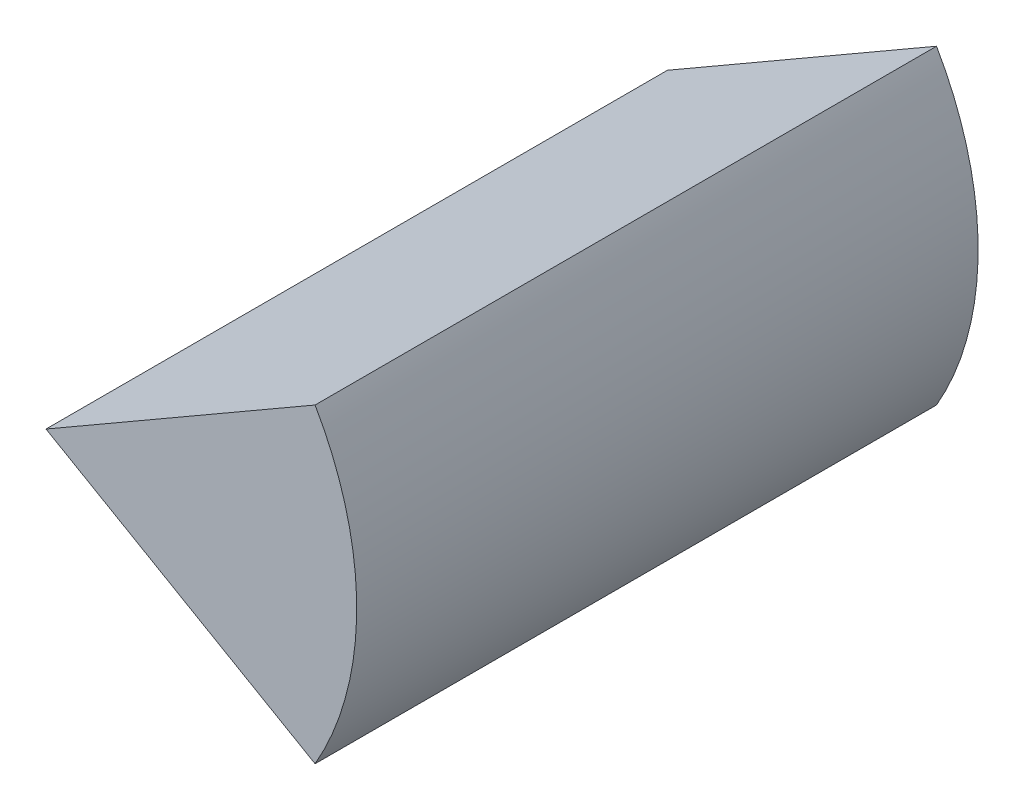
ISO-10303-21;
HEADER;
FILE_DESCRIPTION(('STEP AP214'),'2;1');
FILE_NAME('part.step','',(''),(''),'','','');
FILE_SCHEMA(('AUTOMOTIVE_DESIGN { 1 0 10303 214 1 1 1 1 }'));
ENDSEC;
DATA;
#1=APPLICATION_CONTEXT('core data for automotive mechanical design processes');
#2=APPLICATION_PROTOCOL_DEFINITION('international standard','automotive_design',2000,#1);
#3=PRODUCT_CONTEXT('',#1,'mechanical');
#4=PRODUCT('Part','Part','',(#3));
#5=PRODUCT_RELATED_PRODUCT_CATEGORY('part','',(#4));
#6=PRODUCT_DEFINITION_FORMATION('','',#4);
#7=PRODUCT_DEFINITION_CONTEXT('part definition',#1,'design');
#8=PRODUCT_DEFINITION('design','',#6,#7);
#9=PRODUCT_DEFINITION_SHAPE('','',#8);
#10=(LENGTH_UNIT() NAMED_UNIT(*) SI_UNIT(.MILLI.,.METRE.));
#11=(NAMED_UNIT(*) PLANE_ANGLE_UNIT() SI_UNIT($,.RADIAN.));
#12=(NAMED_UNIT(*) SI_UNIT($,.STERADIAN.) SOLID_ANGLE_UNIT());
#13=UNCERTAINTY_MEASURE_WITH_UNIT(LENGTH_MEASURE(1.E-05),#10,'distance_accuracy_value','');
#14=(GEOMETRIC_REPRESENTATION_CONTEXT(3) GLOBAL_UNCERTAINTY_ASSIGNED_CONTEXT((#13)) GLOBAL_UNIT_ASSIGNED_CONTEXT((#10,
#11,#12)) REPRESENTATION_CONTEXT('',''));
#15=CARTESIAN_POINT('',(0.,0.,0.));
#16=DIRECTION('',(0.,0.,1.));
#17=DIRECTION('',(1.,0.,0.));
#18=AXIS2_PLACEMENT_3D('',#15,#16,#17);
#19=CARTESIAN_POINT('',(0.,0.,50.));
#20=DIRECTION('',(0.500000000000001,0.866025403784438,0.));
#21=DIRECTION('',(-0.866025403784438,0.500000000000001,0.));
#22=AXIS2_PLACEMENT_3D('',#19,#20,#21);
#23=PLANE('',#22);
#24=DIRECTION('',(0.866025403784438,-0.500000000000001,0.));
#25=VECTOR('',#24,1.);
#26=CARTESIAN_POINT('',(0.,0.,0.));
#27=LINE('',#26,#25);
#28=CARTESIAN_POINT('',(0.,0.,0.));
#29=VERTEX_POINT('',#28);
#30=CARTESIAN_POINT('',(21.650635094611,-12.5,0.));
#31=VERTEX_POINT('',#30);
#32=EDGE_CURVE('E80',#29,#31,#27,.T.);
#33=ORIENTED_EDGE('',*,*,#32,.T.);
#34=DIRECTION('',(0.,0.,-1.));
#35=VECTOR('',#34,1.);
#36=CARTESIAN_POINT('',(21.650635094611,-12.5,50.));
#37=LINE('',#36,#35);
#38=CARTESIAN_POINT('',(21.650635094611,-12.5,50.));
#39=VERTEX_POINT('',#38);
#40=EDGE_CURVE('E11',#39,#31,#37,.T.);
#41=ORIENTED_EDGE('',*,*,#40,.F.);
#42=DIRECTION('',(0.866025403784438,-0.500000000000001,0.));
#43=VECTOR('',#42,1.);
#44=CARTESIAN_POINT('',(0.,0.,50.));
#45=LINE('',#44,#43);
#46=CARTESIAN_POINT('',(0.,0.,50.));
#47=VERTEX_POINT('',#46);
#48=EDGE_CURVE('E73',#47,#39,#45,.T.);
#49=ORIENTED_EDGE('',*,*,#48,.F.);
#50=DIRECTION('',(0.,0.,-1.));
#51=VECTOR('',#50,1.);
#52=CARTESIAN_POINT('',(0.,0.,50.));
#53=LINE('',#52,#51);
#54=EDGE_CURVE('E81',#47,#29,#53,.T.);
#55=ORIENTED_EDGE('',*,*,#54,.T.);
#56=EDGE_LOOP('',(#33,#41,#49,#55));
#57=FACE_BOUND('',#56,.T.);
#58=ADVANCED_FACE('F33',(#57),#23,.F.);
#59=CARTESIAN_POINT('',(0.,0.,50.));
#60=DIRECTION('',(0.,0.,-1.));
#61=DIRECTION('',(-1.,0.,0.));
#62=AXIS2_PLACEMENT_3D('',#59,#60,#61);
#63=CYLINDRICAL_SURFACE('',#62,25.);
#64=CARTESIAN_POINT('',(0.,0.,0.));
#65=DIRECTION('',(0.,0.,1.));
#66=DIRECTION('',(1.,0.,0.));
#67=AXIS2_PLACEMENT_3D('',#64,#65,#66);
#68=CIRCLE('',#67,25.);
#69=CARTESIAN_POINT('',(21.650635094611,12.5,0.));
#70=VERTEX_POINT('',#69);
#71=EDGE_CURVE('E61',#31,#70,#68,.T.);
#72=ORIENTED_EDGE('',*,*,#71,.T.);
#73=DIRECTION('',(0.,0.,-1.));
#74=VECTOR('',#73,1.);
#75=CARTESIAN_POINT('',(21.650635094611,12.5,50.));
#76=LINE('',#75,#74);
#77=CARTESIAN_POINT('',(21.650635094611,12.5,50.));
#78=VERTEX_POINT('',#77);
#79=EDGE_CURVE('E41',#78,#70,#76,.T.);
#80=ORIENTED_EDGE('',*,*,#79,.F.);
#81=CARTESIAN_POINT('',(0.,0.,50.));
#82=DIRECTION('',(0.,0.,1.));
#83=DIRECTION('',(1.,0.,0.));
#84=AXIS2_PLACEMENT_3D('',#81,#82,#83);
#85=CIRCLE('',#84,25.);
#86=EDGE_CURVE('E69',#39,#78,#85,.T.);
#87=ORIENTED_EDGE('',*,*,#86,.F.);
#88=ORIENTED_EDGE('',*,*,#40,.T.);
#89=EDGE_LOOP('',(#72,#80,#87,#88));
#90=FACE_BOUND('',#89,.T.);
#91=ADVANCED_FACE('F70',(#90),#63,.T.);
#92=CARTESIAN_POINT('',(0.,0.,50.));
#93=DIRECTION('',(0.5,-0.866025403784439,0.));
#94=DIRECTION('',(0.866025403784439,0.5,0.));
#95=AXIS2_PLACEMENT_3D('',#92,#93,#94);
#96=PLANE('',#95);
#97=DIRECTION('',(-0.866025403784439,-0.5,0.));
#98=VECTOR('',#97,1.);
#99=CARTESIAN_POINT('',(0.,0.,0.));
#100=LINE('',#99,#98);
#101=EDGE_CURVE('E66',#70,#29,#100,.T.);
#102=ORIENTED_EDGE('',*,*,#101,.T.);
#103=ORIENTED_EDGE('',*,*,#54,.F.);
#104=DIRECTION('',(-0.866025403784439,-0.5,0.));
#105=VECTOR('',#104,1.);
#106=CARTESIAN_POINT('',(0.,0.,50.));
#107=LINE('',#106,#105);
#108=EDGE_CURVE('E49',#78,#47,#107,.T.);
#109=ORIENTED_EDGE('',*,*,#108,.F.);
#110=ORIENTED_EDGE('',*,*,#79,.T.);
#111=EDGE_LOOP('',(#102,#103,#109,#110));
#112=FACE_BOUND('',#111,.T.);
#113=ADVANCED_FACE('F92',(#112),#96,.F.);
#114=CARTESIAN_POINT('',(0.,0.,50.));
#115=DIRECTION('',(0.,0.,1.));
#116=DIRECTION('',(1.,0.,0.));
#117=AXIS2_PLACEMENT_3D('',#114,#115,#116);
#118=PLANE('',#117);
#119=ORIENTED_EDGE('',*,*,#48,.T.);
#120=ORIENTED_EDGE('',*,*,#86,.T.);
#121=ORIENTED_EDGE('',*,*,#108,.T.);
#122=EDGE_LOOP('',(#119,#120,#121));
#123=FACE_BOUND('',#122,.T.);
#124=ADVANCED_FACE('F76',(#123),#118,.T.);
#125=CARTESIAN_POINT('',(0.,0.,0.));
#126=DIRECTION('',(0.,0.,1.));
#127=DIRECTION('',(1.,0.,0.));
#128=AXIS2_PLACEMENT_3D('',#125,#126,#127);
#129=PLANE('',#128);
#130=CARTESIAN_POINT('',(15.9211821327958,0.366074021024481,0.));
#131=DIRECTION('',(0.,0.,-1.));
#132=DIRECTION('',(-1.,0.,0.));
#133=AXIS2_PLACEMENT_3D('',#130,#131,#132);
#134=CIRCLE('',#133,5.);
#135=CARTESIAN_POINT('',(10.9211821327958,0.366074021024481,0.));
#136=VERTEX_POINT('',#135);
#137=EDGE_CURVE('E87',#136,#136,#134,.T.);
#138=ORIENTED_EDGE('',*,*,#137,.F.);
#139=EDGE_LOOP('',(#138));
#140=FACE_BOUND('',#139,.T.);
#141=ORIENTED_EDGE('',*,*,#32,.F.);
#142=ORIENTED_EDGE('',*,*,#101,.F.);
#143=ORIENTED_EDGE('',*,*,#71,.F.);
#144=EDGE_LOOP('',(#141,#142,#143));
#145=FACE_BOUND('',#144,.T.);
#146=ADVANCED_FACE('F93',(#140,#145),#129,.F.);
#147=CARTESIAN_POINT('',(15.9211821327958,0.366074021024481,10.));
#148=DIRECTION('',(0.,0.,-1.));
#149=DIRECTION('',(-1.,0.,0.));
#150=AXIS2_PLACEMENT_3D('',#147,#148,#149);
#151=CYLINDRICAL_SURFACE('',#150,5.);
#152=CARTESIAN_POINT('',(15.9211821327958,0.366074021024481,10.));
#153=DIRECTION('',(0.,0.,-1.));
#154=DIRECTION('',(-1.,0.,0.));
#155=AXIS2_PLACEMENT_3D('',#152,#153,#154);
#156=CIRCLE('',#155,5.);
#157=CARTESIAN_POINT('',(10.9211821327958,0.366074021024481,10.));
#158=VERTEX_POINT('',#157);
#159=EDGE_CURVE('E83',#158,#158,#156,.T.);
#160=ORIENTED_EDGE('',*,*,#159,.F.);
#161=EDGE_LOOP('',(#160));
#162=FACE_BOUND('',#161,.T.);
#163=ORIENTED_EDGE('',*,*,#137,.T.);
#164=EDGE_LOOP('',(#163));
#165=FACE_BOUND('',#164,.T.);
#166=ADVANCED_FACE('F95',(#162,#165),#151,.F.);
#167=CARTESIAN_POINT('',(15.9211821327958,0.366074021024481,10.));
#168=DIRECTION('',(0.,0.,-1.));
#169=DIRECTION('',(-1.,0.,0.));
#170=AXIS2_PLACEMENT_3D('',#167,#168,#169);
#171=PLANE('',#170);
#172=ORIENTED_EDGE('',*,*,#159,.T.);
#173=EDGE_LOOP('',(#172));
#174=FACE_BOUND('',#173,.T.);
#175=ADVANCED_FACE('F102',(#174),#171,.T.);
#176=CLOSED_SHELL('',(#58,#91,#113,#124,#146,#166,#175));
#177=MANIFOLD_SOLID_BREP('B2',#176);
#178=ADVANCED_BREP_SHAPE_REPRESENTATION('',(#18,#177),#14);
#179=SHAPE_DEFINITION_REPRESENTATION(#9,#178);
ENDSEC;
END-ISO-10303-21;
